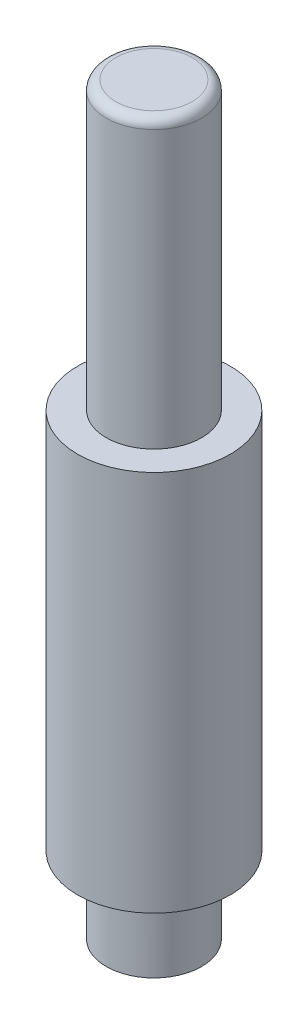
ISO-10303-21;
HEADER;
FILE_DESCRIPTION(('STEP AP214'),'2;1');
FILE_NAME('part.step','',(''),(''),'','','');
FILE_SCHEMA(('AUTOMOTIVE_DESIGN { 1 0 10303 214 1 1 1 1 }'));
ENDSEC;
DATA;
#1=APPLICATION_CONTEXT('core data for automotive mechanical design processes');
#2=APPLICATION_PROTOCOL_DEFINITION('international standard','automotive_design',2000,#1);
#3=PRODUCT_CONTEXT('',#1,'mechanical');
#4=PRODUCT('Part','Part','',(#3));
#5=PRODUCT_RELATED_PRODUCT_CATEGORY('part','',(#4));
#6=PRODUCT_DEFINITION_FORMATION('','',#4);
#7=PRODUCT_DEFINITION_CONTEXT('part definition',#1,'design');
#8=PRODUCT_DEFINITION('design','',#6,#7);
#9=PRODUCT_DEFINITION_SHAPE('','',#8);
#10=(LENGTH_UNIT() NAMED_UNIT(*) SI_UNIT(.MILLI.,.METRE.));
#11=(NAMED_UNIT(*) PLANE_ANGLE_UNIT() SI_UNIT($,.RADIAN.));
#12=(NAMED_UNIT(*) SI_UNIT($,.STERADIAN.) SOLID_ANGLE_UNIT());
#13=UNCERTAINTY_MEASURE_WITH_UNIT(LENGTH_MEASURE(1.E-05),#10,'distance_accuracy_value','');
#14=(GEOMETRIC_REPRESENTATION_CONTEXT(3) GLOBAL_UNCERTAINTY_ASSIGNED_CONTEXT((#13)) GLOBAL_UNIT_ASSIGNED_CONTEXT((#10,
#11,#12)) REPRESENTATION_CONTEXT('',''));
#15=CARTESIAN_POINT('',(0.,0.,0.));
#16=DIRECTION('',(0.,0.,1.));
#17=DIRECTION('',(1.,0.,0.));
#18=AXIS2_PLACEMENT_3D('',#15,#16,#17);
#19=CARTESIAN_POINT('',(0.,10.,0.));
#20=DIRECTION('',(0.,-1.,0.));
#21=DIRECTION('',(0.,0.,-1.));
#22=AXIS2_PLACEMENT_3D('',#19,#20,#21);
#23=CONICAL_SURFACE('',#22,3.3,1.02974425867665);
#24=CARTESIAN_POINT('',(0.,11.982840042791,0.));
#25=VERTEX_POINT('',#24);
#26=VERTEX_LOOP('',#25);
#27=FACE_BOUND('',#26,.T.);
#28=CARTESIAN_POINT('',(0.,10.,0.));
#29=DIRECTION('',(0.,-1.,0.));
#30=DIRECTION('',(0.,0.,-1.));
#31=AXIS2_PLACEMENT_3D('',#28,#29,#30);
#32=CIRCLE('',#31,3.3);
#33=CARTESIAN_POINT('',(0.,10.,-3.3));
#34=VERTEX_POINT('',#33);
#35=EDGE_CURVE('E66',#34,#34,#32,.T.);
#36=ORIENTED_EDGE('',*,*,#35,.T.);
#37=EDGE_LOOP('',(#36));
#38=FACE_BOUND('',#37,.T.);
#39=ADVANCED_FACE('F50',(#27,#38),#23,.F.);
#40=CARTESIAN_POINT('',(0.,0.,0.));
#41=DIRECTION('',(0.,-1.,0.));
#42=DIRECTION('',(0.,0.,-1.));
#43=AXIS2_PLACEMENT_3D('',#40,#41,#42);
#44=CYLINDRICAL_SURFACE('',#43,3.3);
#45=CARTESIAN_POINT('',(0.,0.,0.));
#46=DIRECTION('',(0.,-1.,0.));
#47=DIRECTION('',(0.,0.,-1.));
#48=AXIS2_PLACEMENT_3D('',#45,#46,#47);
#49=CIRCLE('',#48,3.3);
#50=CARTESIAN_POINT('',(0.,0.,-3.3));
#51=VERTEX_POINT('',#50);
#52=EDGE_CURVE('E75',#51,#51,#49,.T.);
#53=ORIENTED_EDGE('',*,*,#52,.T.);
#54=EDGE_LOOP('',(#53));
#55=FACE_BOUND('',#54,.T.);
#56=ORIENTED_EDGE('',*,*,#35,.F.);
#57=EDGE_LOOP('',(#56));
#58=FACE_BOUND('',#57,.T.);
#59=ADVANCED_FACE('F62',(#55,#58),#44,.F.);
#60=CARTESIAN_POINT('',(0.,7.5,0.));
#61=DIRECTION('',(0.,-1.,0.));
#62=DIRECTION('',(0.,0.,-1.));
#63=AXIS2_PLACEMENT_3D('',#60,#61,#62);
#64=CYLINDRICAL_SURFACE('',#63,5.);
#65=CARTESIAN_POINT('',(0.,7.5,0.));
#66=DIRECTION('',(0.,1.,0.));
#67=DIRECTION('',(0.,0.,1.));
#68=AXIS2_PLACEMENT_3D('',#65,#66,#67);
#69=CIRCLE('',#68,5.);
#70=CARTESIAN_POINT('',(0.,7.5,5.));
#71=VERTEX_POINT('',#70);
#72=EDGE_CURVE('E88',#71,#71,#69,.T.);
#73=ORIENTED_EDGE('',*,*,#72,.F.);
#74=EDGE_LOOP('',(#73));
#75=FACE_BOUND('',#74,.T.);
#76=CARTESIAN_POINT('',(0.,0.,0.));
#77=DIRECTION('',(0.,-1.,0.));
#78=DIRECTION('',(0.,0.,-1.));
#79=AXIS2_PLACEMENT_3D('',#76,#77,#78);
#80=CIRCLE('',#79,5.);
#81=CARTESIAN_POINT('',(0.,0.,-5.));
#82=VERTEX_POINT('',#81);
#83=EDGE_CURVE('E69',#82,#82,#80,.T.);
#84=ORIENTED_EDGE('',*,*,#83,.F.);
#85=EDGE_LOOP('',(#84));
#86=FACE_BOUND('',#85,.T.);
#87=ADVANCED_FACE('F140',(#75,#86),#64,.T.);
#88=CARTESIAN_POINT('',(0.,7.5,0.));
#89=DIRECTION('',(0.,1.,0.));
#90=DIRECTION('',(0.,0.,1.));
#91=AXIS2_PLACEMENT_3D('',#88,#89,#90);
#92=PLANE('',#91);
#93=CARTESIAN_POINT('',(0.,7.5,0.));
#94=DIRECTION('',(0.,1.,0.));
#95=DIRECTION('',(0.,0.,1.));
#96=AXIS2_PLACEMENT_3D('',#93,#94,#95);
#97=CIRCLE('',#96,4.5);
#98=CARTESIAN_POINT('',(0.,7.5,4.5));
#99=VERTEX_POINT('',#98);
#100=EDGE_CURVE('E82',#99,#99,#97,.T.);
#101=ORIENTED_EDGE('',*,*,#100,.F.);
#102=EDGE_LOOP('',(#101));
#103=FACE_BOUND('',#102,.T.);
#104=ORIENTED_EDGE('',*,*,#72,.T.);
#105=EDGE_LOOP('',(#104));
#106=FACE_BOUND('',#105,.T.);
#107=ADVANCED_FACE('F137',(#103,#106),#92,.T.);
#108=CARTESIAN_POINT('',(0.,8.,0.));
#109=DIRECTION('',(0.,-1.,0.));
#110=DIRECTION('',(0.,0.,-1.));
#111=AXIS2_PLACEMENT_3D('',#108,#109,#110);
#112=CYLINDRICAL_SURFACE('',#111,4.5);
#113=CARTESIAN_POINT('',(0.,8.,0.));
#114=DIRECTION('',(0.,1.,0.));
#115=DIRECTION('',(0.,0.,1.));
#116=AXIS2_PLACEMENT_3D('',#113,#114,#115);
#117=CIRCLE('',#116,4.5);
#118=CARTESIAN_POINT('',(0.,8.,4.5));
#119=VERTEX_POINT('',#118);
#120=EDGE_CURVE('E84',#119,#119,#117,.T.);
#121=ORIENTED_EDGE('',*,*,#120,.F.);
#122=EDGE_LOOP('',(#121));
#123=FACE_BOUND('',#122,.T.);
#124=ORIENTED_EDGE('',*,*,#100,.T.);
#125=EDGE_LOOP('',(#124));
#126=FACE_BOUND('',#125,.T.);
#127=ADVANCED_FACE('F125',(#123,#126),#112,.T.);
#128=CARTESIAN_POINT('',(0.,48.,0.));
#129=DIRECTION('',(0.,-1.,0.));
#130=DIRECTION('',(0.,0.,-1.));
#131=AXIS2_PLACEMENT_3D('',#128,#129,#130);
#132=CYLINDRICAL_SURFACE('',#131,8.);
#133=CARTESIAN_POINT('',(0.,48.,0.));
#134=DIRECTION('',(0.,1.,0.));
#135=DIRECTION('',(0.,0.,1.));
#136=AXIS2_PLACEMENT_3D('',#133,#134,#135);
#137=CIRCLE('',#136,8.);
#138=CARTESIAN_POINT('',(0.,48.,8.));
#139=VERTEX_POINT('',#138);
#140=EDGE_CURVE('E72',#139,#139,#137,.T.);
#141=ORIENTED_EDGE('',*,*,#140,.F.);
#142=EDGE_LOOP('',(#141));
#143=FACE_BOUND('',#142,.T.);
#144=CARTESIAN_POINT('',(0.,8.,0.));
#145=DIRECTION('',(0.,1.,0.));
#146=DIRECTION('',(0.,0.,1.));
#147=AXIS2_PLACEMENT_3D('',#144,#145,#146);
#148=CIRCLE('',#147,8.);
#149=CARTESIAN_POINT('',(0.,8.,8.));
#150=VERTEX_POINT('',#149);
#151=EDGE_CURVE('E68',#150,#150,#148,.T.);
#152=ORIENTED_EDGE('',*,*,#151,.T.);
#153=EDGE_LOOP('',(#152));
#154=FACE_BOUND('',#153,.T.);
#155=ADVANCED_FACE('F119',(#143,#154),#132,.T.);
#156=CARTESIAN_POINT('',(0.,48.,0.));
#157=DIRECTION('',(0.,1.,0.));
#158=DIRECTION('',(0.,0.,1.));
#159=AXIS2_PLACEMENT_3D('',#156,#157,#158);
#160=PLANE('',#159);
#161=CARTESIAN_POINT('',(0.,48.,0.));
#162=DIRECTION('',(0.,1.,0.));
#163=DIRECTION('',(0.,0.,1.));
#164=AXIS2_PLACEMENT_3D('',#161,#162,#163);
#165=CIRCLE('',#164,5.);
#166=CARTESIAN_POINT('',(0.,48.,5.));
#167=VERTEX_POINT('',#166);
#168=EDGE_CURVE('E79',#167,#167,#165,.T.);
#169=ORIENTED_EDGE('',*,*,#168,.F.);
#170=EDGE_LOOP('',(#169));
#171=FACE_BOUND('',#170,.T.);
#172=ORIENTED_EDGE('',*,*,#140,.T.);
#173=EDGE_LOOP('',(#172));
#174=FACE_BOUND('',#173,.T.);
#175=ADVANCED_FACE('F116',(#171,#174),#160,.T.);
#176=CARTESIAN_POINT('',(0.,8.,0.));
#177=DIRECTION('',(0.,1.,0.));
#178=DIRECTION('',(0.,0.,1.));
#179=AXIS2_PLACEMENT_3D('',#176,#177,#178);
#180=PLANE('',#179);
#181=ORIENTED_EDGE('',*,*,#120,.T.);
#182=EDGE_LOOP('',(#181));
#183=FACE_BOUND('',#182,.T.);
#184=ORIENTED_EDGE('',*,*,#151,.F.);
#185=EDGE_LOOP('',(#184));
#186=FACE_BOUND('',#185,.T.);
#187=ADVANCED_FACE('F112',(#183,#186),#180,.F.);
#188=CARTESIAN_POINT('',(0.,78.,0.));
#189=DIRECTION('',(0.,-1.,0.));
#190=DIRECTION('',(0.,0.,-1.));
#191=AXIS2_PLACEMENT_3D('',#188,#189,#190);
#192=CYLINDRICAL_SURFACE('',#191,5.);
#193=CARTESIAN_POINT('',(0.,77.,0.));
#194=DIRECTION('',(0.,1.,0.));
#195=DIRECTION('',(0.,0.,1.));
#196=AXIS2_PLACEMENT_3D('',#193,#194,#195);
#197=CIRCLE('',#196,5.);
#198=CARTESIAN_POINT('',(0.,77.,5.));
#199=VERTEX_POINT('',#198);
#200=EDGE_CURVE('E13',#199,#199,#197,.F.);
#201=ORIENTED_EDGE('',*,*,#200,.T.);
#202=EDGE_LOOP('',(#201));
#203=FACE_BOUND('',#202,.T.);
#204=ORIENTED_EDGE('',*,*,#168,.T.);
#205=EDGE_LOOP('',(#204));
#206=FACE_BOUND('',#205,.T.);
#207=ADVANCED_FACE('F106',(#203,#206),#192,.T.);
#208=CARTESIAN_POINT('',(0.,78.,0.));
#209=DIRECTION('',(0.,1.,0.));
#210=DIRECTION('',(0.,0.,1.));
#211=AXIS2_PLACEMENT_3D('',#208,#209,#210);
#212=PLANE('',#211);
#213=CARTESIAN_POINT('',(0.,78.,0.));
#214=DIRECTION('',(0.,1.,0.));
#215=DIRECTION('',(0.,0.,1.));
#216=AXIS2_PLACEMENT_3D('',#213,#214,#215);
#217=CIRCLE('',#216,4.);
#218=CARTESIAN_POINT('',(0.,78.,4.));
#219=VERTEX_POINT('',#218);
#220=EDGE_CURVE('E57',#219,#219,#217,.T.);
#221=ORIENTED_EDGE('',*,*,#220,.T.);
#222=EDGE_LOOP('',(#221));
#223=FACE_BOUND('',#222,.T.);
#224=ADVANCED_FACE('F95',(#223),#212,.T.);
#225=CARTESIAN_POINT('',(0.,77.,0.));
#226=DIRECTION('',(0.,1.,0.));
#227=DIRECTION('',(0.,0.,1.));
#228=AXIS2_PLACEMENT_3D('',#225,#226,#227);
#229=TOROIDAL_SURFACE('',#228,4.,1.);
#230=ORIENTED_EDGE('',*,*,#200,.F.);
#231=EDGE_LOOP('',(#230));
#232=FACE_BOUND('',#231,.T.);
#233=ORIENTED_EDGE('',*,*,#220,.F.);
#234=EDGE_LOOP('',(#233));
#235=FACE_BOUND('',#234,.T.);
#236=ADVANCED_FACE('F52',(#232,#235),#229,.T.);
#237=CARTESIAN_POINT('',(0.,0.,0.));
#238=DIRECTION('',(0.,-1.,0.));
#239=DIRECTION('',(0.,0.,-1.));
#240=AXIS2_PLACEMENT_3D('',#237,#238,#239);
#241=PLANE('',#240);
#242=ORIENTED_EDGE('',*,*,#52,.F.);
#243=EDGE_LOOP('',(#242));
#244=FACE_BOUND('',#243,.T.);
#245=ORIENTED_EDGE('',*,*,#83,.T.);
#246=EDGE_LOOP('',(#245));
#247=FACE_BOUND('',#246,.T.);
#248=ADVANCED_FACE('F98',(#244,#247),#241,.T.);
#249=CLOSED_SHELL('',(#39,#59,#87,#107,#127,#155,#175,#187,#207,#224,#236,#248));
#250=MANIFOLD_SOLID_BREP('B2',#249);
#251=ADVANCED_BREP_SHAPE_REPRESENTATION('',(#18,#250),#14);
#252=SHAPE_DEFINITION_REPRESENTATION(#9,#251);
ENDSEC;
END-ISO-10303-21;
